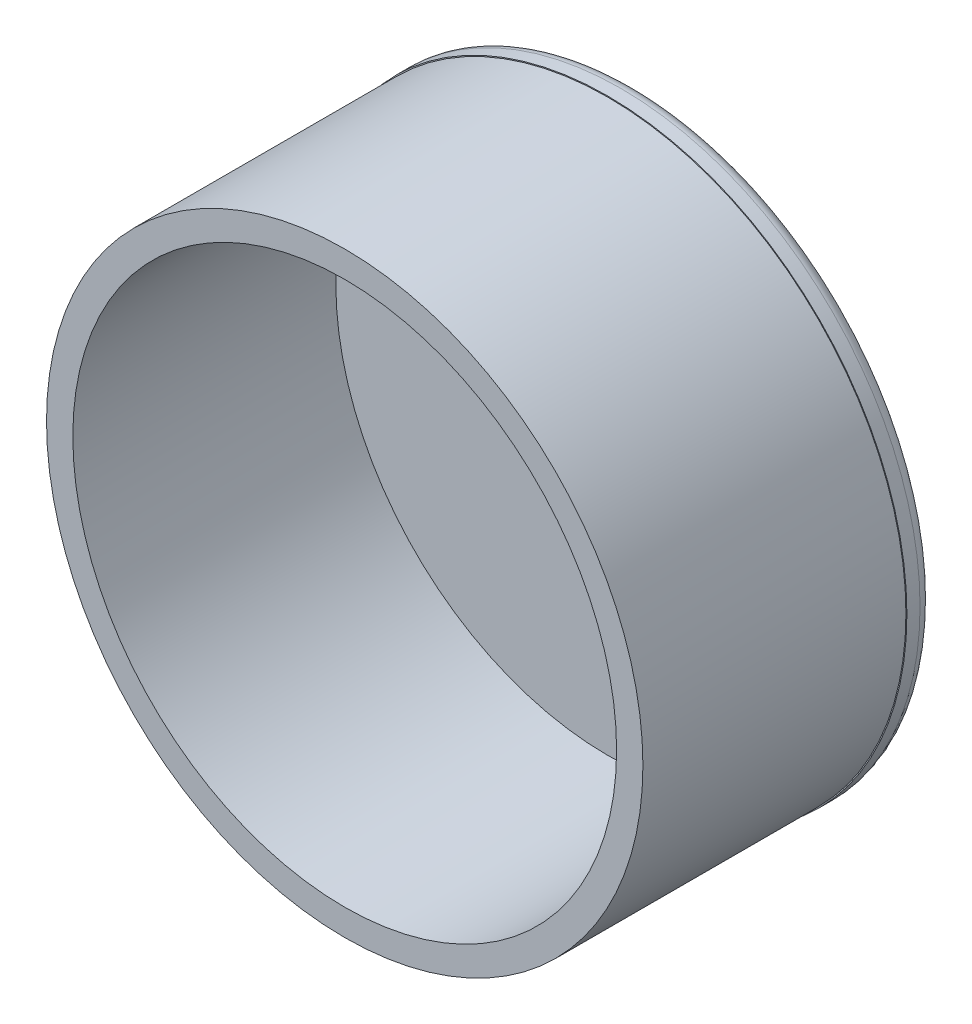
ISO-10303-21;
HEADER;
FILE_DESCRIPTION(('STEP AP214'),'2;1');
FILE_NAME('part.step','',(''),(''),'','','');
FILE_SCHEMA(('AUTOMOTIVE_DESIGN { 1 0 10303 214 1 1 1 1 }'));
ENDSEC;
DATA;
#1=APPLICATION_CONTEXT('core data for automotive mechanical design processes');
#2=APPLICATION_PROTOCOL_DEFINITION('international standard','automotive_design',2000,#1);
#3=PRODUCT_CONTEXT('',#1,'mechanical');
#4=PRODUCT('Part','Part','',(#3));
#5=PRODUCT_RELATED_PRODUCT_CATEGORY('part','',(#4));
#6=PRODUCT_DEFINITION_FORMATION('','',#4);
#7=PRODUCT_DEFINITION_CONTEXT('part definition',#1,'design');
#8=PRODUCT_DEFINITION('design','',#6,#7);
#9=PRODUCT_DEFINITION_SHAPE('','',#8);
#10=(LENGTH_UNIT() NAMED_UNIT(*) SI_UNIT(.MILLI.,.METRE.));
#11=(NAMED_UNIT(*) PLANE_ANGLE_UNIT() SI_UNIT($,.RADIAN.));
#12=(NAMED_UNIT(*) SI_UNIT($,.STERADIAN.) SOLID_ANGLE_UNIT());
#13=UNCERTAINTY_MEASURE_WITH_UNIT(LENGTH_MEASURE(1.E-05),#10,'distance_accuracy_value','');
#14=(GEOMETRIC_REPRESENTATION_CONTEXT(3) GLOBAL_UNCERTAINTY_ASSIGNED_CONTEXT((#13)) GLOBAL_UNIT_ASSIGNED_CONTEXT((#10,
#11,#12)) REPRESENTATION_CONTEXT('',''));
#15=CARTESIAN_POINT('',(0.,0.,0.));
#16=DIRECTION('',(0.,0.,1.));
#17=DIRECTION('',(1.,0.,0.));
#18=AXIS2_PLACEMENT_3D('',#15,#16,#17);
#19=CARTESIAN_POINT('',(0.,0.,2.));
#20=DIRECTION('',(0.,0.,-1.));
#21=DIRECTION('',(-1.,0.,0.));
#22=AXIS2_PLACEMENT_3D('',#19,#20,#21);
#23=CYLINDRICAL_SURFACE('',#22,22.75);
#24=CARTESIAN_POINT('',(0.,0.,1.));
#25=DIRECTION('',(0.,0.,1.));
#26=DIRECTION('',(1.,0.,0.));
#27=AXIS2_PLACEMENT_3D('',#24,#25,#26);
#28=CIRCLE('',#27,22.75);
#29=CARTESIAN_POINT('',(22.75,0.,1.));
#30=VERTEX_POINT('',#29);
#31=EDGE_CURVE('E38',#30,#30,#28,.T.);
#32=ORIENTED_EDGE('',*,*,#31,.T.);
#33=EDGE_LOOP('',(#32));
#34=FACE_BOUND('',#33,.T.);
#35=CARTESIAN_POINT('',(0.,0.,2.));
#36=DIRECTION('',(0.,0.,1.));
#37=DIRECTION('',(1.,0.,0.));
#38=AXIS2_PLACEMENT_3D('',#35,#36,#37);
#39=CIRCLE('',#38,22.75);
#40=CARTESIAN_POINT('',(22.75,0.,2.));
#41=VERTEX_POINT('',#40);
#42=EDGE_CURVE('E46',#41,#41,#39,.T.);
#43=ORIENTED_EDGE('',*,*,#42,.F.);
#44=EDGE_LOOP('',(#43));
#45=FACE_BOUND('',#44,.T.);
#46=ADVANCED_FACE('F31',(#34,#45),#23,.T.);
#47=CARTESIAN_POINT('',(0.,0.,2.));
#48=DIRECTION('',(0.,0.,1.));
#49=DIRECTION('',(1.,0.,0.));
#50=AXIS2_PLACEMENT_3D('',#47,#48,#49);
#51=PLANE('',#50);
#52=CARTESIAN_POINT('',(0.,0.,2.));
#53=DIRECTION('',(0.,0.,1.));
#54=DIRECTION('',(1.,0.,0.));
#55=AXIS2_PLACEMENT_3D('',#52,#53,#54);
#56=CIRCLE('',#55,22.6754236820827);
#57=CARTESIAN_POINT('',(22.6754236820827,0.,2.));
#58=VERTEX_POINT('',#57);
#59=EDGE_CURVE('E52',#58,#58,#56,.T.);
#60=ORIENTED_EDGE('',*,*,#59,.F.);
#61=EDGE_LOOP('',(#60));
#62=FACE_BOUND('',#61,.T.);
#63=ORIENTED_EDGE('',*,*,#42,.T.);
#64=EDGE_LOOP('',(#63));
#65=FACE_BOUND('',#64,.T.);
#66=ADVANCED_FACE('F76',(#62,#65),#51,.T.);
#67=CARTESIAN_POINT('',(0.,0.,0.));
#68=DIRECTION('',(0.,0.,1.));
#69=DIRECTION('',(1.,0.,0.));
#70=AXIS2_PLACEMENT_3D('',#67,#68,#69);
#71=PLANE('',#70);
#72=CARTESIAN_POINT('',(0.,0.,0.));
#73=DIRECTION('',(0.,0.,1.));
#74=DIRECTION('',(1.,0.,0.));
#75=AXIS2_PLACEMENT_3D('',#72,#73,#74);
#76=CIRCLE('',#75,21.75);
#77=CARTESIAN_POINT('',(21.75,0.,0.));
#78=VERTEX_POINT('',#77);
#79=EDGE_CURVE('E10',#78,#78,#76,.F.);
#80=ORIENTED_EDGE('',*,*,#79,.T.);
#81=EDGE_LOOP('',(#80));
#82=FACE_BOUND('',#81,.T.);
#83=ADVANCED_FACE('F67',(#82),#71,.F.);
#84=CARTESIAN_POINT('',(0.,0.,22.));
#85=DIRECTION('',(0.,0.,1.));
#86=DIRECTION('',(1.,0.,0.));
#87=AXIS2_PLACEMENT_3D('',#84,#85,#86);
#88=PLANE('',#87);
#89=CARTESIAN_POINT('',(0.,0.,22.));
#90=DIRECTION('',(0.,0.,1.));
#91=DIRECTION('',(1.,0.,0.));
#92=AXIS2_PLACEMENT_3D('',#89,#90,#91);
#93=CIRCLE('',#92,22.6754236820827);
#94=CARTESIAN_POINT('',(22.6754236820827,0.,22.));
#95=VERTEX_POINT('',#94);
#96=EDGE_CURVE('E51',#95,#95,#93,.T.);
#97=ORIENTED_EDGE('',*,*,#96,.T.);
#98=EDGE_LOOP('',(#97));
#99=FACE_BOUND('',#98,.T.);
#100=CARTESIAN_POINT('',(0.,0.,22.));
#101=DIRECTION('',(0.,0.,1.));
#102=DIRECTION('',(1.,0.,0.));
#103=AXIS2_PLACEMENT_3D('',#100,#101,#102);
#104=CIRCLE('',#103,20.6754236820827);
#105=CARTESIAN_POINT('',(20.6754236820827,0.,22.));
#106=VERTEX_POINT('',#105);
#107=EDGE_CURVE('E55',#106,#106,#104,.T.);
#108=ORIENTED_EDGE('',*,*,#107,.F.);
#109=EDGE_LOOP('',(#108));
#110=FACE_BOUND('',#109,.T.);
#111=ADVANCED_FACE('F64',(#99,#110),#88,.T.);
#112=CARTESIAN_POINT('',(0.,0.,22.));
#113=DIRECTION('',(0.,0.,-1.));
#114=DIRECTION('',(-1.,0.,0.));
#115=AXIS2_PLACEMENT_3D('',#112,#113,#114);
#116=CYLINDRICAL_SURFACE('',#115,22.6754236820827);
#117=ORIENTED_EDGE('',*,*,#96,.F.);
#118=EDGE_LOOP('',(#117));
#119=FACE_BOUND('',#118,.T.);
#120=ORIENTED_EDGE('',*,*,#59,.T.);
#121=EDGE_LOOP('',(#120));
#122=FACE_BOUND('',#121,.T.);
#123=ADVANCED_FACE('F66',(#119,#122),#116,.T.);
#124=CARTESIAN_POINT('',(0.,0.,22.));
#125=DIRECTION('',(0.,0.,-1.));
#126=DIRECTION('',(-1.,0.,0.));
#127=AXIS2_PLACEMENT_3D('',#124,#125,#126);
#128=CYLINDRICAL_SURFACE('',#127,20.6754236820827);
#129=ORIENTED_EDGE('',*,*,#107,.T.);
#130=EDGE_LOOP('',(#129));
#131=FACE_BOUND('',#130,.T.);
#132=CARTESIAN_POINT('',(0.,0.,2.));
#133=DIRECTION('',(0.,0.,1.));
#134=DIRECTION('',(1.,0.,0.));
#135=AXIS2_PLACEMENT_3D('',#132,#133,#134);
#136=CIRCLE('',#135,20.6754236820827);
#137=CARTESIAN_POINT('',(20.6754236820827,0.,2.));
#138=VERTEX_POINT('',#137);
#139=EDGE_CURVE('E42',#138,#138,#136,.F.);
#140=ORIENTED_EDGE('',*,*,#139,.T.);
#141=EDGE_LOOP('',(#140));
#142=FACE_BOUND('',#141,.T.);
#143=ADVANCED_FACE('F61',(#131,#142),#128,.F.);
#144=ORIENTED_EDGE('',*,*,#139,.F.);
#145=EDGE_LOOP('',(#144));
#146=FACE_BOUND('',#145,.T.);
#147=ADVANCED_FACE('F85',(#146),#51,.T.);
#148=CARTESIAN_POINT('',(0.,0.,1.));
#149=DIRECTION('',(0.,0.,1.));
#150=DIRECTION('',(1.,0.,0.));
#151=AXIS2_PLACEMENT_3D('',#148,#149,#150);
#152=TOROIDAL_SURFACE('',#151,21.75,1.);
#153=ORIENTED_EDGE('',*,*,#79,.F.);
#154=EDGE_LOOP('',(#153));
#155=FACE_BOUND('',#154,.T.);
#156=ORIENTED_EDGE('',*,*,#31,.F.);
#157=EDGE_LOOP('',(#156));
#158=FACE_BOUND('',#157,.T.);
#159=ADVANCED_FACE('F33',(#155,#158),#152,.T.);
#160=CLOSED_SHELL('',(#46,#66,#83,#111,#123,#143,#147,#159));
#161=MANIFOLD_SOLID_BREP('B2',#160);
#162=ADVANCED_BREP_SHAPE_REPRESENTATION('',(#18,#161),#14);
#163=SHAPE_DEFINITION_REPRESENTATION(#9,#162);
ENDSEC;
END-ISO-10303-21;
